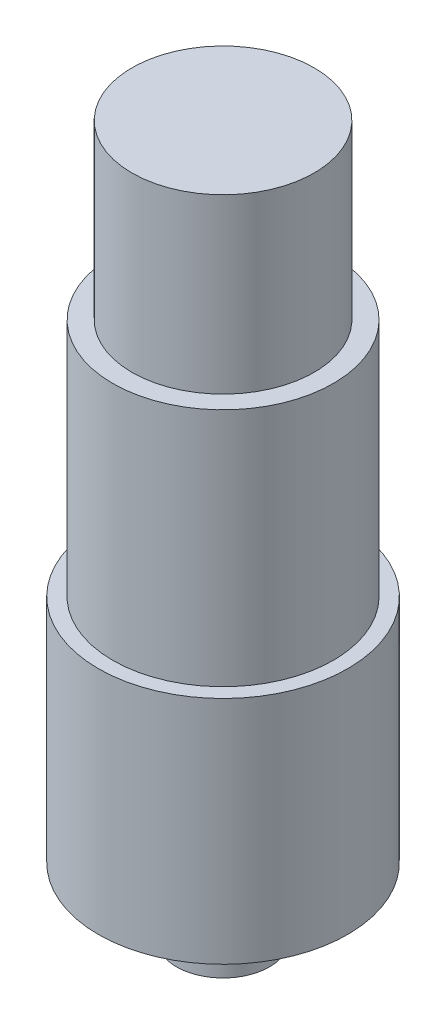
ISO-10303-21;
HEADER;
FILE_DESCRIPTION(('STEP AP214'),'2;1');
FILE_NAME('part.step','',(''),(''),'','','');
FILE_SCHEMA(('AUTOMOTIVE_DESIGN { 1 0 10303 214 1 1 1 1 }'));
ENDSEC;
DATA;
#1=APPLICATION_CONTEXT('core data for automotive mechanical design processes');
#2=APPLICATION_PROTOCOL_DEFINITION('international standard','automotive_design',2000,#1);
#3=PRODUCT_CONTEXT('',#1,'mechanical');
#4=PRODUCT('Part','Part','',(#3));
#5=PRODUCT_RELATED_PRODUCT_CATEGORY('part','',(#4));
#6=PRODUCT_DEFINITION_FORMATION('','',#4);
#7=PRODUCT_DEFINITION_CONTEXT('part definition',#1,'design');
#8=PRODUCT_DEFINITION('design','',#6,#7);
#9=PRODUCT_DEFINITION_SHAPE('','',#8);
#10=(LENGTH_UNIT() NAMED_UNIT(*) SI_UNIT(.MILLI.,.METRE.));
#11=(NAMED_UNIT(*) PLANE_ANGLE_UNIT() SI_UNIT($,.RADIAN.));
#12=(NAMED_UNIT(*) SI_UNIT($,.STERADIAN.) SOLID_ANGLE_UNIT());
#13=UNCERTAINTY_MEASURE_WITH_UNIT(LENGTH_MEASURE(1.E-05),#10,'distance_accuracy_value','');
#14=(GEOMETRIC_REPRESENTATION_CONTEXT(3) GLOBAL_UNCERTAINTY_ASSIGNED_CONTEXT((#13)) GLOBAL_UNIT_ASSIGNED_CONTEXT((#10,
#11,#12)) REPRESENTATION_CONTEXT('',''));
#15=CARTESIAN_POINT('',(0.,0.,0.));
#16=DIRECTION('',(0.,0.,1.));
#17=DIRECTION('',(1.,0.,0.));
#18=AXIS2_PLACEMENT_3D('',#15,#16,#17);
#19=CARTESIAN_POINT('',(0.,67.,0.));
#20=DIRECTION('',(0.,1.,0.));
#21=DIRECTION('',(0.,0.,1.));
#22=AXIS2_PLACEMENT_3D('',#19,#20,#21);
#23=PLANE('',#22);
#24=CARTESIAN_POINT('',(0.,67.,0.));
#25=DIRECTION('',(0.,1.,0.));
#26=DIRECTION('',(0.,0.,1.));
#27=AXIS2_PLACEMENT_3D('',#24,#25,#26);
#28=CIRCLE('',#27,9.5);
#29=CARTESIAN_POINT('',(0.,67.,9.5));
#30=VERTEX_POINT('',#29);
#31=EDGE_CURVE('E66',#30,#30,#28,.T.);
#32=ORIENTED_EDGE('',*,*,#31,.T.);
#33=EDGE_LOOP('',(#32));
#34=FACE_BOUND('',#33,.T.);
#35=ADVANCED_FACE('F38',(#34),#23,.T.);
#36=CARTESIAN_POINT('',(0.,-7.,0.));
#37=DIRECTION('',(0.,-1.,0.));
#38=DIRECTION('',(0.,0.,-1.));
#39=AXIS2_PLACEMENT_3D('',#36,#37,#38);
#40=PLANE('',#39);
#41=CARTESIAN_POINT('',(0.,-7.00000000000001,0.));
#42=DIRECTION('',(0.,1.,0.));
#43=DIRECTION('',(0.,0.,1.));
#44=AXIS2_PLACEMENT_3D('',#41,#42,#43);
#45=CIRCLE('',#44,4.85000000000001);
#46=CARTESIAN_POINT('',(0.,-7.00000000000001,4.85000000000001));
#47=VERTEX_POINT('',#46);
#48=EDGE_CURVE('E10',#47,#47,#45,.T.);
#49=ORIENTED_EDGE('',*,*,#48,.F.);
#50=EDGE_LOOP('',(#49));
#51=FACE_BOUND('',#50,.T.);
#52=ADVANCED_FACE('F83',(#51),#40,.T.);
#53=CARTESIAN_POINT('',(0.,73.4471424481413,0.));
#54=DIRECTION('',(0.,1.,0.));
#55=DIRECTION('',(0.,0.,1.));
#56=AXIS2_PLACEMENT_3D('',#53,#54,#55);
#57=CYLINDRICAL_SURFACE('',#56,4.85000000000001);
#58=ORIENTED_EDGE('',*,*,#48,.T.);
#59=EDGE_LOOP('',(#58));
#60=FACE_BOUND('',#59,.T.);
#61=CARTESIAN_POINT('',(0.,0.,0.));
#62=DIRECTION('',(0.,1.,0.));
#63=DIRECTION('',(0.,0.,1.));
#64=AXIS2_PLACEMENT_3D('',#61,#62,#63);
#65=CIRCLE('',#64,4.85000000000001);
#66=CARTESIAN_POINT('',(0.,0.,4.85000000000001));
#67=VERTEX_POINT('',#66);
#68=EDGE_CURVE('E44',#67,#67,#65,.T.);
#69=ORIENTED_EDGE('',*,*,#68,.F.);
#70=EDGE_LOOP('',(#69));
#71=FACE_BOUND('',#70,.T.);
#72=ADVANCED_FACE('F87',(#60,#71),#57,.T.);
#73=CARTESIAN_POINT('',(0.,0.,0.));
#74=DIRECTION('',(0.,-1.,0.));
#75=DIRECTION('',(0.,0.,-1.));
#76=AXIS2_PLACEMENT_3D('',#73,#74,#75);
#77=PLANE('',#76);
#78=ORIENTED_EDGE('',*,*,#68,.T.);
#79=EDGE_LOOP('',(#78));
#80=FACE_BOUND('',#79,.T.);
#81=CARTESIAN_POINT('',(0.,0.,0.));
#82=DIRECTION('',(0.,1.,0.));
#83=DIRECTION('',(0.,0.,1.));
#84=AXIS2_PLACEMENT_3D('',#81,#82,#83);
#85=CIRCLE('',#84,13.);
#86=CARTESIAN_POINT('',(0.,0.,13.));
#87=VERTEX_POINT('',#86);
#88=EDGE_CURVE('E48',#87,#87,#85,.T.);
#89=ORIENTED_EDGE('',*,*,#88,.F.);
#90=EDGE_LOOP('',(#89));
#91=FACE_BOUND('',#90,.T.);
#92=ADVANCED_FACE('F92',(#80,#91),#77,.T.);
#93=CARTESIAN_POINT('',(0.,73.4471424481413,0.));
#94=DIRECTION('',(0.,1.,0.));
#95=DIRECTION('',(0.,0.,1.));
#96=AXIS2_PLACEMENT_3D('',#93,#94,#95);
#97=CYLINDRICAL_SURFACE('',#96,13.);
#98=ORIENTED_EDGE('',*,*,#88,.T.);
#99=EDGE_LOOP('',(#98));
#100=FACE_BOUND('',#99,.T.);
#101=CARTESIAN_POINT('',(0.,24.,0.));
#102=DIRECTION('',(0.,1.,0.));
#103=DIRECTION('',(0.,0.,1.));
#104=AXIS2_PLACEMENT_3D('',#101,#102,#103);
#105=CIRCLE('',#104,13.);
#106=CARTESIAN_POINT('',(0.,24.,13.));
#107=VERTEX_POINT('',#106);
#108=EDGE_CURVE('E52',#107,#107,#105,.T.);
#109=ORIENTED_EDGE('',*,*,#108,.F.);
#110=EDGE_LOOP('',(#109));
#111=FACE_BOUND('',#110,.T.);
#112=ADVANCED_FACE('F97',(#100,#111),#97,.T.);
#113=CARTESIAN_POINT('',(0.,24.,0.));
#114=DIRECTION('',(0.,1.,0.));
#115=DIRECTION('',(0.,0.,1.));
#116=AXIS2_PLACEMENT_3D('',#113,#114,#115);
#117=PLANE('',#116);
#118=ORIENTED_EDGE('',*,*,#108,.T.);
#119=EDGE_LOOP('',(#118));
#120=FACE_BOUND('',#119,.T.);
#121=CARTESIAN_POINT('',(0.,24.,0.));
#122=DIRECTION('',(0.,1.,0.));
#123=DIRECTION('',(0.,0.,1.));
#124=AXIS2_PLACEMENT_3D('',#121,#122,#123);
#125=CIRCLE('',#124,11.5);
#126=CARTESIAN_POINT('',(0.,24.,11.5));
#127=VERTEX_POINT('',#126);
#128=EDGE_CURVE('E57',#127,#127,#125,.T.);
#129=ORIENTED_EDGE('',*,*,#128,.F.);
#130=EDGE_LOOP('',(#129));
#131=FACE_BOUND('',#130,.T.);
#132=ADVANCED_FACE('F100',(#120,#131),#117,.T.);
#133=CARTESIAN_POINT('',(0.,73.4471424481413,0.));
#134=DIRECTION('',(0.,1.,0.));
#135=DIRECTION('',(0.,0.,1.));
#136=AXIS2_PLACEMENT_3D('',#133,#134,#135);
#137=CYLINDRICAL_SURFACE('',#136,11.5);
#138=ORIENTED_EDGE('',*,*,#128,.T.);
#139=EDGE_LOOP('',(#138));
#140=FACE_BOUND('',#139,.T.);
#141=CARTESIAN_POINT('',(0.,49.,0.));
#142=DIRECTION('',(0.,1.,0.));
#143=DIRECTION('',(0.,0.,1.));
#144=AXIS2_PLACEMENT_3D('',#141,#142,#143);
#145=CIRCLE('',#144,11.5);
#146=CARTESIAN_POINT('',(0.,49.,11.5));
#147=VERTEX_POINT('',#146);
#148=EDGE_CURVE('E60',#147,#147,#145,.T.);
#149=ORIENTED_EDGE('',*,*,#148,.F.);
#150=EDGE_LOOP('',(#149));
#151=FACE_BOUND('',#150,.T.);
#152=ADVANCED_FACE('F79',(#140,#151),#137,.T.);
#153=CARTESIAN_POINT('',(0.,49.,0.));
#154=DIRECTION('',(0.,1.,0.));
#155=DIRECTION('',(0.,0.,1.));
#156=AXIS2_PLACEMENT_3D('',#153,#154,#155);
#157=PLANE('',#156);
#158=ORIENTED_EDGE('',*,*,#148,.T.);
#159=EDGE_LOOP('',(#158));
#160=FACE_BOUND('',#159,.T.);
#161=CARTESIAN_POINT('',(0.,49.,0.));
#162=DIRECTION('',(0.,1.,0.));
#163=DIRECTION('',(0.,0.,1.));
#164=AXIS2_PLACEMENT_3D('',#161,#162,#163);
#165=CIRCLE('',#164,9.5);
#166=CARTESIAN_POINT('',(0.,49.,9.5));
#167=VERTEX_POINT('',#166);
#168=EDGE_CURVE('E63',#167,#167,#165,.T.);
#169=ORIENTED_EDGE('',*,*,#168,.F.);
#170=EDGE_LOOP('',(#169));
#171=FACE_BOUND('',#170,.T.);
#172=ADVANCED_FACE('F73',(#160,#171),#157,.T.);
#173=CARTESIAN_POINT('',(0.,73.4471424481413,0.));
#174=DIRECTION('',(0.,1.,0.));
#175=DIRECTION('',(0.,0.,1.));
#176=AXIS2_PLACEMENT_3D('',#173,#174,#175);
#177=CYLINDRICAL_SURFACE('',#176,9.5);
#178=ORIENTED_EDGE('',*,*,#168,.T.);
#179=EDGE_LOOP('',(#178));
#180=FACE_BOUND('',#179,.T.);
#181=ORIENTED_EDGE('',*,*,#31,.F.);
#182=EDGE_LOOP('',(#181));
#183=FACE_BOUND('',#182,.T.);
#184=ADVANCED_FACE('F71',(#180,#183),#177,.T.);
#185=CLOSED_SHELL('',(#35,#52,#72,#92,#112,#132,#152,#172,#184));
#186=MANIFOLD_SOLID_BREP('B2',#185);
#187=ADVANCED_BREP_SHAPE_REPRESENTATION('',(#18,#186),#14);
#188=SHAPE_DEFINITION_REPRESENTATION(#9,#187);
ENDSEC;
END-ISO-10303-21;
